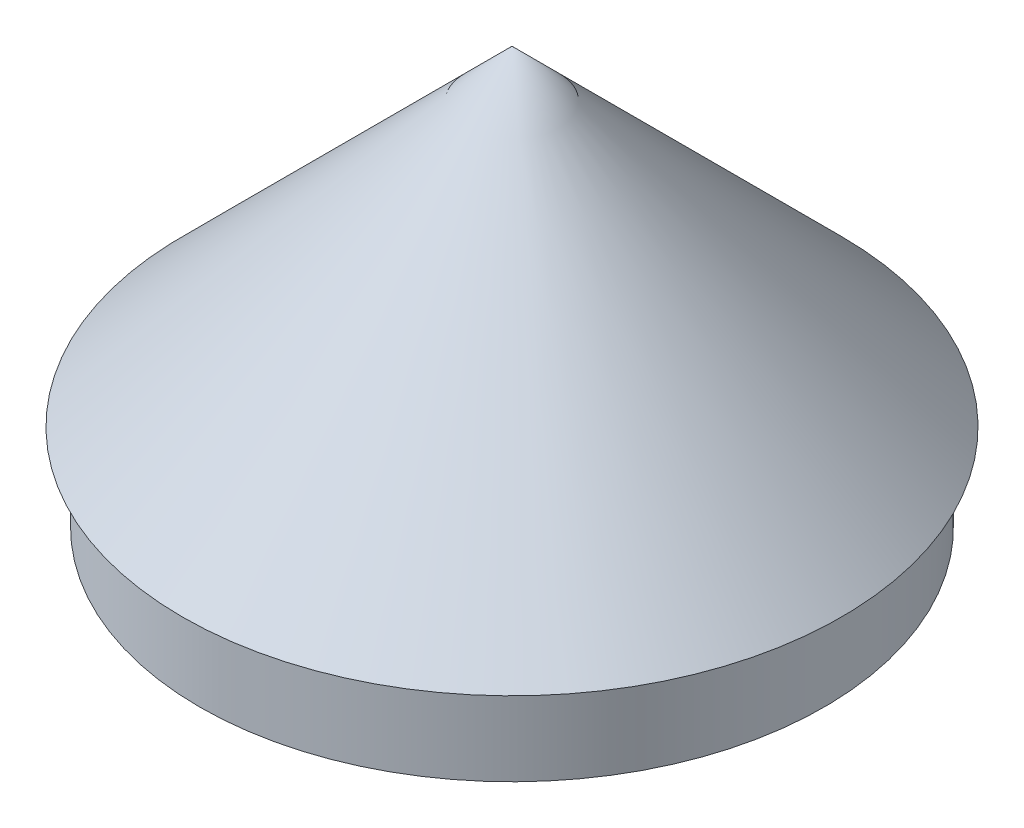
ISO-10303-21;
HEADER;
FILE_DESCRIPTION(('STEP AP214'),'2;1');
FILE_NAME('part.step','',(''),(''),'','','');
FILE_SCHEMA(('AUTOMOTIVE_DESIGN { 1 0 10303 214 1 1 1 1 }'));
ENDSEC;
DATA;
#1=APPLICATION_CONTEXT('core data for automotive mechanical design processes');
#2=APPLICATION_PROTOCOL_DEFINITION('international standard','automotive_design',2000,#1);
#3=PRODUCT_CONTEXT('',#1,'mechanical');
#4=PRODUCT('Part','Part','',(#3));
#5=PRODUCT_RELATED_PRODUCT_CATEGORY('part','',(#4));
#6=PRODUCT_DEFINITION_FORMATION('','',#4);
#7=PRODUCT_DEFINITION_CONTEXT('part definition',#1,'design');
#8=PRODUCT_DEFINITION('design','',#6,#7);
#9=PRODUCT_DEFINITION_SHAPE('','',#8);
#10=(LENGTH_UNIT() NAMED_UNIT(*) SI_UNIT(.MILLI.,.METRE.));
#11=(NAMED_UNIT(*) PLANE_ANGLE_UNIT() SI_UNIT($,.RADIAN.));
#12=(NAMED_UNIT(*) SI_UNIT($,.STERADIAN.) SOLID_ANGLE_UNIT());
#13=UNCERTAINTY_MEASURE_WITH_UNIT(LENGTH_MEASURE(1.E-05),#10,'distance_accuracy_value','');
#14=(GEOMETRIC_REPRESENTATION_CONTEXT(3) GLOBAL_UNCERTAINTY_ASSIGNED_CONTEXT((#13)) GLOBAL_UNIT_ASSIGNED_CONTEXT((#10,
#11,#12)) REPRESENTATION_CONTEXT('',''));
#15=CARTESIAN_POINT('',(0.,0.,0.));
#16=DIRECTION('',(0.,0.,1.));
#17=DIRECTION('',(1.,0.,0.));
#18=AXIS2_PLACEMENT_3D('',#15,#16,#17);
#19=CARTESIAN_POINT('',(0.,5.,0.));
#20=DIRECTION('',(0.,-1.,0.));
#21=DIRECTION('',(0.,0.,-1.));
#22=AXIS2_PLACEMENT_3D('',#19,#20,#21);
#23=CYLINDRICAL_SURFACE('',#22,18.);
#24=CARTESIAN_POINT('',(0.,5.,0.));
#25=DIRECTION('',(0.,1.,0.));
#26=DIRECTION('',(0.,0.,1.));
#27=AXIS2_PLACEMENT_3D('',#24,#25,#26);
#28=CIRCLE('',#27,18.);
#29=CARTESIAN_POINT('',(0.,5.,18.));
#30=VERTEX_POINT('',#29);
#31=EDGE_CURVE('E11',#30,#30,#28,.T.);
#32=ORIENTED_EDGE('',*,*,#31,.F.);
#33=EDGE_LOOP('',(#32));
#34=FACE_BOUND('',#33,.T.);
#35=CARTESIAN_POINT('',(0.,0.,0.));
#36=DIRECTION('',(0.,1.,0.));
#37=DIRECTION('',(0.,0.,1.));
#38=AXIS2_PLACEMENT_3D('',#35,#36,#37);
#39=CIRCLE('',#38,18.);
#40=CARTESIAN_POINT('',(0.,0.,18.));
#41=VERTEX_POINT('',#40);
#42=EDGE_CURVE('E37',#41,#41,#39,.T.);
#43=ORIENTED_EDGE('',*,*,#42,.T.);
#44=EDGE_LOOP('',(#43));
#45=FACE_BOUND('',#44,.T.);
#46=ADVANCED_FACE('F34',(#34,#45),#23,.T.);
#47=CARTESIAN_POINT('',(0.,0.,0.));
#48=DIRECTION('',(0.,1.,0.));
#49=DIRECTION('',(0.,0.,1.));
#50=AXIS2_PLACEMENT_3D('',#47,#48,#49);
#51=PLANE('',#50);
#52=ORIENTED_EDGE('',*,*,#42,.F.);
#53=EDGE_LOOP('',(#52));
#54=FACE_BOUND('',#53,.T.);
#55=ADVANCED_FACE('F47',(#54),#51,.F.);
#56=CARTESIAN_POINT('',(0.,5.,0.));
#57=DIRECTION('',(0.,-1.,0.));
#58=DIRECTION('',(0.,0.,1.));
#59=AXIS2_PLACEMENT_3D('',#56,#57,#58);
#60=CONICAL_SURFACE('',#59,19.,0.78539816339745);
#61=CARTESIAN_POINT('',(0.,23.9999999999999,0.));
#62=VERTEX_POINT('',#61);
#63=VERTEX_LOOP('',#62);
#64=FACE_BOUND('',#63,.T.);
#65=CARTESIAN_POINT('',(0.,5.,0.));
#66=DIRECTION('',(0.,1.,0.));
#67=DIRECTION('',(0.,0.,1.));
#68=AXIS2_PLACEMENT_3D('',#65,#66,#67);
#69=CIRCLE('',#68,19.);
#70=CARTESIAN_POINT('',(0.,5.,19.));
#71=VERTEX_POINT('',#70);
#72=EDGE_CURVE('E51',#71,#71,#69,.T.);
#73=ORIENTED_EDGE('',*,*,#72,.T.);
#74=EDGE_LOOP('',(#73));
#75=FACE_BOUND('',#74,.T.);
#76=ADVANCED_FACE('F43',(#64,#75),#60,.T.);
#77=CARTESIAN_POINT('',(0.,5.,0.));
#78=DIRECTION('',(0.,1.,0.));
#79=DIRECTION('',(0.,0.,1.));
#80=AXIS2_PLACEMENT_3D('',#77,#78,#79);
#81=PLANE('',#80);
#82=ORIENTED_EDGE('',*,*,#31,.T.);
#83=EDGE_LOOP('',(#82));
#84=FACE_BOUND('',#83,.T.);
#85=ORIENTED_EDGE('',*,*,#72,.F.);
#86=EDGE_LOOP('',(#85));
#87=FACE_BOUND('',#86,.T.);
#88=ADVANCED_FACE('F46',(#84,#87),#81,.F.);
#89=CLOSED_SHELL('',(#46,#55,#76,#88));
#90=MANIFOLD_SOLID_BREP('B2',#89);
#91=ADVANCED_BREP_SHAPE_REPRESENTATION('',(#18,#90),#14);
#92=SHAPE_DEFINITION_REPRESENTATION(#9,#91);
ENDSEC;
END-ISO-10303-21;
